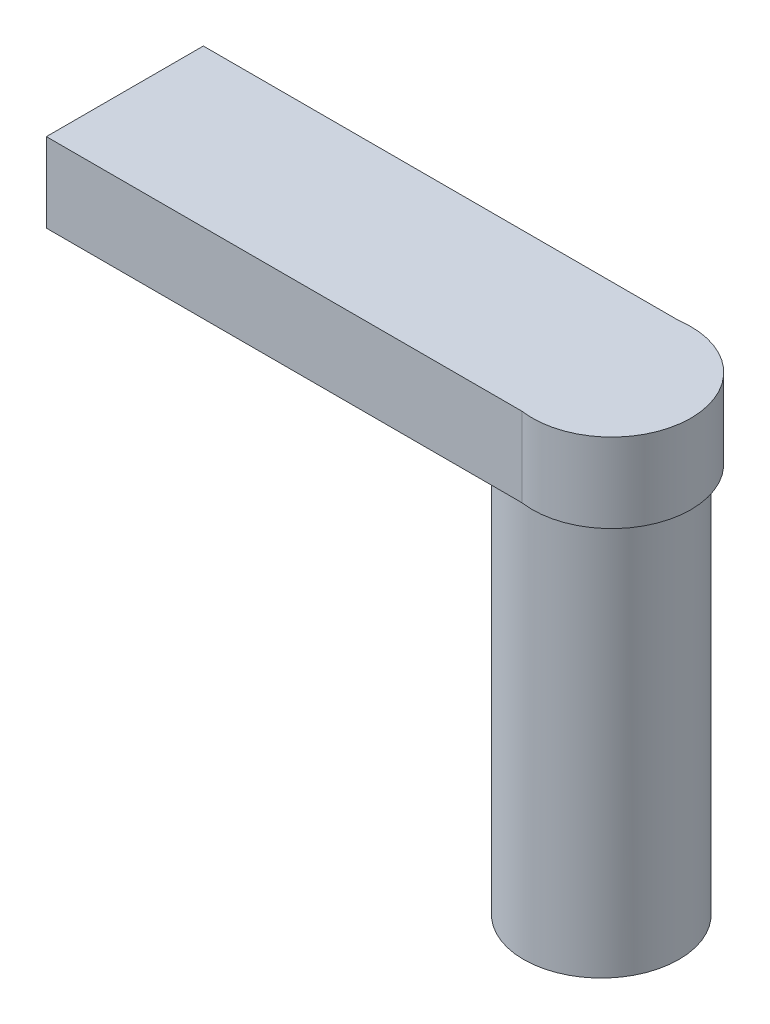
ISO-10303-21;
HEADER;
FILE_DESCRIPTION(('STEP AP214'),'2;1');
FILE_NAME('part.step','',(''),(''),'','','');
FILE_SCHEMA(('AUTOMOTIVE_DESIGN { 1 0 10303 214 1 1 1 1 }'));
ENDSEC;
DATA;
#1=APPLICATION_CONTEXT('core data for automotive mechanical design processes');
#2=APPLICATION_PROTOCOL_DEFINITION('international standard','automotive_design',2000,#1);
#3=PRODUCT_CONTEXT('',#1,'mechanical');
#4=PRODUCT('Part','Part','',(#3));
#5=PRODUCT_RELATED_PRODUCT_CATEGORY('part','',(#4));
#6=PRODUCT_DEFINITION_FORMATION('','',#4);
#7=PRODUCT_DEFINITION_CONTEXT('part definition',#1,'design');
#8=PRODUCT_DEFINITION('design','',#6,#7);
#9=PRODUCT_DEFINITION_SHAPE('','',#8);
#10=(LENGTH_UNIT() NAMED_UNIT(*) SI_UNIT(.MILLI.,.METRE.));
#11=(NAMED_UNIT(*) PLANE_ANGLE_UNIT() SI_UNIT($,.RADIAN.));
#12=(NAMED_UNIT(*) SI_UNIT($,.STERADIAN.) SOLID_ANGLE_UNIT());
#13=UNCERTAINTY_MEASURE_WITH_UNIT(LENGTH_MEASURE(1.E-05),#10,'distance_accuracy_value','');
#14=(GEOMETRIC_REPRESENTATION_CONTEXT(3) GLOBAL_UNCERTAINTY_ASSIGNED_CONTEXT((#13)) GLOBAL_UNIT_ASSIGNED_CONTEXT((#10,
#11,#12)) REPRESENTATION_CONTEXT('',''));
#15=CARTESIAN_POINT('',(0.,0.,0.));
#16=DIRECTION('',(0.,0.,1.));
#17=DIRECTION('',(1.,0.,0.));
#18=AXIS2_PLACEMENT_3D('',#15,#16,#17);
#19=CARTESIAN_POINT('',(0.,25.,0.));
#20=DIRECTION('',(0.,-1.,0.));
#21=DIRECTION('',(0.,0.,-1.));
#22=AXIS2_PLACEMENT_3D('',#19,#20,#21);
#23=CYLINDRICAL_SURFACE('',#22,4.9);
#24=CARTESIAN_POINT('',(0.,25.,0.));
#25=DIRECTION('',(0.,1.,0.));
#26=DIRECTION('',(0.,0.,1.));
#27=AXIS2_PLACEMENT_3D('',#24,#25,#26);
#28=CIRCLE('',#27,4.9);
#29=CARTESIAN_POINT('',(0.,25.,-4.9));
#30=VERTEX_POINT('',#29);
#31=EDGE_CURVE('E11',#30,#30,#28,.T.);
#32=ORIENTED_EDGE('',*,*,#31,.F.);
#33=EDGE_LOOP('',(#32));
#34=FACE_BOUND('',#33,.T.);
#35=CARTESIAN_POINT('',(0.,0.,0.));
#36=DIRECTION('',(0.,1.,0.));
#37=DIRECTION('',(0.,0.,1.));
#38=AXIS2_PLACEMENT_3D('',#35,#36,#37);
#39=CIRCLE('',#38,4.9);
#40=CARTESIAN_POINT('',(0.,0.,4.9));
#41=VERTEX_POINT('',#40);
#42=EDGE_CURVE('E36',#41,#41,#39,.T.);
#43=ORIENTED_EDGE('',*,*,#42,.T.);
#44=EDGE_LOOP('',(#43));
#45=FACE_BOUND('',#44,.T.);
#46=ADVANCED_FACE('F33',(#34,#45),#23,.T.);
#47=CARTESIAN_POINT('',(0.,0.,0.));
#48=DIRECTION('',(0.,1.,0.));
#49=DIRECTION('',(0.,0.,1.));
#50=AXIS2_PLACEMENT_3D('',#47,#48,#49);
#51=PLANE('',#50);
#52=ORIENTED_EDGE('',*,*,#42,.F.);
#53=EDGE_LOOP('',(#52));
#54=FACE_BOUND('',#53,.T.);
#55=ADVANCED_FACE('F113',(#54),#51,.F.);
#56=CARTESIAN_POINT('',(0.705336798983298,25.,0.0499999999999984));
#57=DIRECTION('',(0.,1.,0.));
#58=DIRECTION('',(0.,0.,1.));
#59=AXIS2_PLACEMENT_3D('',#56,#57,#58);
#60=PLANE('',#59);
#61=DIRECTION('',(-1.,0.,0.));
#62=VECTOR('',#61,1.);
#63=CARTESIAN_POINT('',(0.,25.,-4.9));
#64=LINE('',#63,#62);
#65=CARTESIAN_POINT('',(-30.,25.,-4.9));
#66=VERTEX_POINT('',#65);
#67=EDGE_CURVE('E91',#30,#66,#64,.T.);
#68=ORIENTED_EDGE('',*,*,#67,.F.);
#69=ORIENTED_EDGE('',*,*,#31,.T.);
#70=CARTESIAN_POINT('',(0.705336798983298,25.,0.0499999999999984));
#71=DIRECTION('',(0.,1.,0.));
#72=DIRECTION('',(0.,0.,1.));
#73=AXIS2_PLACEMENT_3D('',#70,#71,#72);
#74=CIRCLE('',#73,5.);
#75=CARTESIAN_POINT('',(0.,25.,5.));
#76=VERTEX_POINT('',#75);
#77=EDGE_CURVE('E101',#76,#30,#74,.T.);
#78=ORIENTED_EDGE('',*,*,#77,.F.);
#79=DIRECTION('',(1.,0.,0.));
#80=VECTOR('',#79,1.);
#81=CARTESIAN_POINT('',(0.,25.,5.));
#82=LINE('',#81,#80);
#83=CARTESIAN_POINT('',(-30.,25.,5.));
#84=VERTEX_POINT('',#83);
#85=EDGE_CURVE('E72',#84,#76,#82,.T.);
#86=ORIENTED_EDGE('',*,*,#85,.F.);
#87=DIRECTION('',(0.,0.,1.));
#88=VECTOR('',#87,1.);
#89=CARTESIAN_POINT('',(-30.,25.,-4.9));
#90=LINE('',#89,#88);
#91=EDGE_CURVE('E66',#66,#84,#90,.T.);
#92=ORIENTED_EDGE('',*,*,#91,.F.);
#93=EDGE_LOOP('',(#68,#69,#78,#86,#92));
#94=FACE_BOUND('',#93,.T.);
#95=ADVANCED_FACE('F115',(#94),#60,.F.);
#96=CARTESIAN_POINT('',(0.705336798983298,30.,0.0499999999999984));
#97=DIRECTION('',(0.,-1.,0.));
#98=DIRECTION('',(0.,0.,-1.));
#99=AXIS2_PLACEMENT_3D('',#96,#97,#98);
#100=CYLINDRICAL_SURFACE('',#99,5.);
#101=ORIENTED_EDGE('',*,*,#77,.T.);
#102=DIRECTION('',(0.,-1.,0.));
#103=VECTOR('',#102,1.);
#104=CARTESIAN_POINT('',(0.,30.,-4.9));
#105=LINE('',#104,#103);
#106=CARTESIAN_POINT('',(0.,30.,-4.9));
#107=VERTEX_POINT('',#106);
#108=EDGE_CURVE('E92',#107,#30,#105,.T.);
#109=ORIENTED_EDGE('',*,*,#108,.F.);
#110=CARTESIAN_POINT('',(0.705336798983298,30.,0.0499999999999984));
#111=DIRECTION('',(0.,1.,0.));
#112=DIRECTION('',(0.,0.,1.));
#113=AXIS2_PLACEMENT_3D('',#110,#111,#112);
#114=CIRCLE('',#113,5.);
#115=CARTESIAN_POINT('',(0.,30.,5.));
#116=VERTEX_POINT('',#115);
#117=EDGE_CURVE('E85',#116,#107,#114,.T.);
#118=ORIENTED_EDGE('',*,*,#117,.F.);
#119=DIRECTION('',(0.,-1.,0.));
#120=VECTOR('',#119,1.);
#121=CARTESIAN_POINT('',(0.,30.,5.));
#122=LINE('',#121,#120);
#123=EDGE_CURVE('E97',#116,#76,#122,.T.);
#124=ORIENTED_EDGE('',*,*,#123,.T.);
#125=EDGE_LOOP('',(#101,#109,#118,#124));
#126=FACE_BOUND('',#125,.T.);
#127=ADVANCED_FACE('F120',(#126),#100,.T.);
#128=CARTESIAN_POINT('',(0.,30.,-4.9));
#129=DIRECTION('',(0.,0.,1.));
#130=DIRECTION('',(1.,0.,0.));
#131=AXIS2_PLACEMENT_3D('',#128,#129,#130);
#132=PLANE('',#131);
#133=ORIENTED_EDGE('',*,*,#67,.T.);
#134=DIRECTION('',(0.,-1.,0.));
#135=VECTOR('',#134,1.);
#136=CARTESIAN_POINT('',(-30.,30.,-4.9));
#137=LINE('',#136,#135);
#138=CARTESIAN_POINT('',(-30.,30.,-4.9));
#139=VERTEX_POINT('',#138);
#140=EDGE_CURVE('E88',#139,#66,#137,.T.);
#141=ORIENTED_EDGE('',*,*,#140,.F.);
#142=DIRECTION('',(-1.,0.,0.));
#143=VECTOR('',#142,1.);
#144=CARTESIAN_POINT('',(0.,30.,-4.9));
#145=LINE('',#144,#143);
#146=EDGE_CURVE('E80',#107,#139,#145,.T.);
#147=ORIENTED_EDGE('',*,*,#146,.F.);
#148=ORIENTED_EDGE('',*,*,#108,.T.);
#149=EDGE_LOOP('',(#133,#141,#147,#148));
#150=FACE_BOUND('',#149,.T.);
#151=ADVANCED_FACE('F89',(#150),#132,.F.);
#152=CARTESIAN_POINT('',(-30.,30.,-4.9));
#153=DIRECTION('',(1.,0.,0.));
#154=DIRECTION('',(0.,0.,-1.));
#155=AXIS2_PLACEMENT_3D('',#152,#153,#154);
#156=PLANE('',#155);
#157=ORIENTED_EDGE('',*,*,#91,.T.);
#158=DIRECTION('',(0.,-1.,0.));
#159=VECTOR('',#158,1.);
#160=CARTESIAN_POINT('',(-30.,30.,5.));
#161=LINE('',#160,#159);
#162=CARTESIAN_POINT('',(-30.,30.,5.));
#163=VERTEX_POINT('',#162);
#164=EDGE_CURVE('E93',#163,#84,#161,.T.);
#165=ORIENTED_EDGE('',*,*,#164,.F.);
#166=DIRECTION('',(0.,0.,1.));
#167=VECTOR('',#166,1.);
#168=CARTESIAN_POINT('',(-30.,30.,-4.9));
#169=LINE('',#168,#167);
#170=EDGE_CURVE('E83',#139,#163,#169,.T.);
#171=ORIENTED_EDGE('',*,*,#170,.F.);
#172=ORIENTED_EDGE('',*,*,#140,.T.);
#173=EDGE_LOOP('',(#157,#165,#171,#172));
#174=FACE_BOUND('',#173,.T.);
#175=ADVANCED_FACE('F95',(#174),#156,.F.);
#176=CARTESIAN_POINT('',(0.,30.,5.));
#177=DIRECTION('',(0.,0.,-1.));
#178=DIRECTION('',(-1.,0.,0.));
#179=AXIS2_PLACEMENT_3D('',#176,#177,#178);
#180=PLANE('',#179);
#181=ORIENTED_EDGE('',*,*,#85,.T.);
#182=ORIENTED_EDGE('',*,*,#123,.F.);
#183=DIRECTION('',(1.,0.,0.));
#184=VECTOR('',#183,1.);
#185=CARTESIAN_POINT('',(0.,30.,5.));
#186=LINE('',#185,#184);
#187=EDGE_CURVE('E49',#163,#116,#186,.T.);
#188=ORIENTED_EDGE('',*,*,#187,.F.);
#189=ORIENTED_EDGE('',*,*,#164,.T.);
#190=EDGE_LOOP('',(#181,#182,#188,#189));
#191=FACE_BOUND('',#190,.T.);
#192=ADVANCED_FACE('F132',(#191),#180,.F.);
#193=CARTESIAN_POINT('',(0.705336798983298,30.,0.0499999999999984));
#194=DIRECTION('',(0.,1.,0.));
#195=DIRECTION('',(0.,0.,1.));
#196=AXIS2_PLACEMENT_3D('',#193,#194,#195);
#197=PLANE('',#196);
#198=ORIENTED_EDGE('',*,*,#117,.T.);
#199=ORIENTED_EDGE('',*,*,#146,.T.);
#200=ORIENTED_EDGE('',*,*,#170,.T.);
#201=ORIENTED_EDGE('',*,*,#187,.T.);
#202=EDGE_LOOP('',(#198,#199,#200,#201));
#203=FACE_BOUND('',#202,.T.);
#204=ADVANCED_FACE('F81',(#203),#197,.T.);
#205=CLOSED_SHELL('',(#46,#55,#95,#127,#151,#175,#192,#204));
#206=MANIFOLD_SOLID_BREP('B2',#205);
#207=ADVANCED_BREP_SHAPE_REPRESENTATION('',(#18,#206),#14);
#208=SHAPE_DEFINITION_REPRESENTATION(#9,#207);
ENDSEC;
END-ISO-10303-21;
